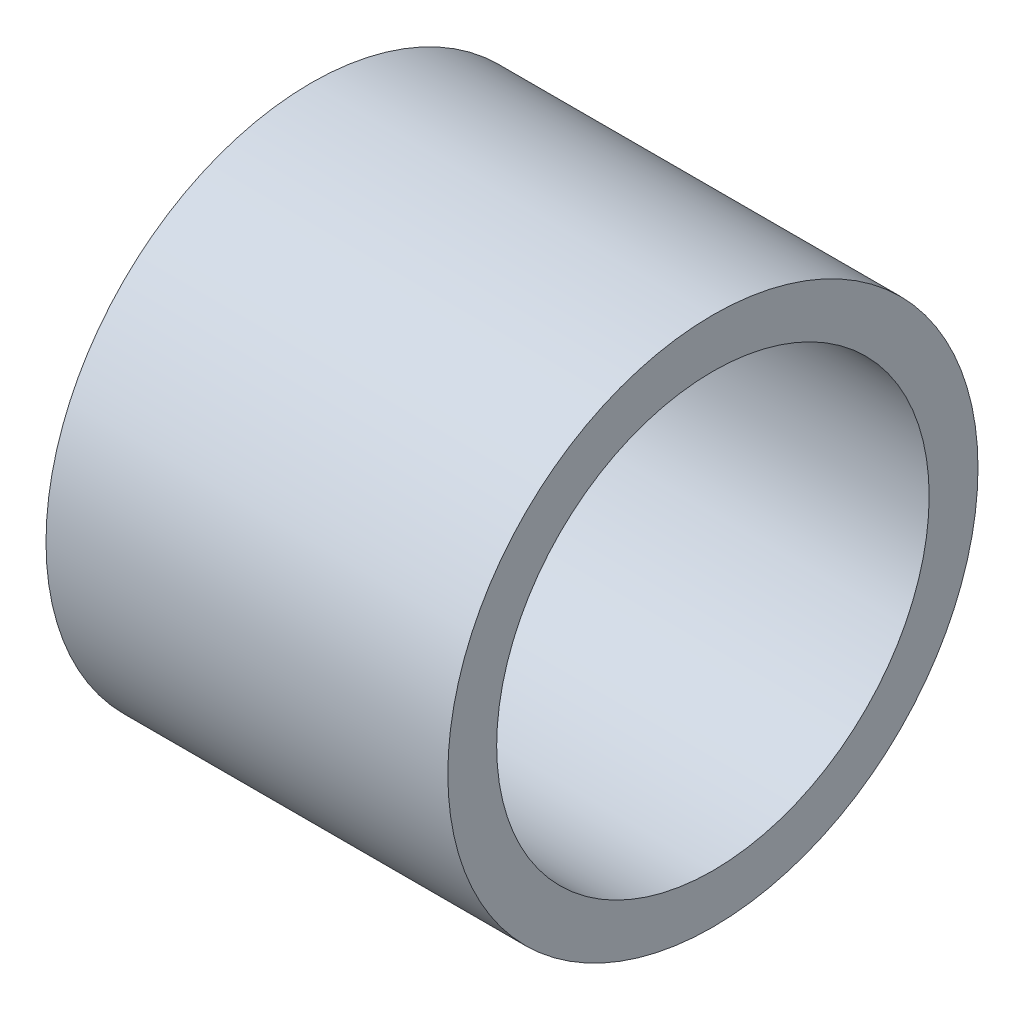
ISO-10303-21;
HEADER;
FILE_DESCRIPTION(('STEP AP214'),'2;1');
FILE_NAME('part.step','',(''),(''),'','','');
FILE_SCHEMA(('AUTOMOTIVE_DESIGN { 1 0 10303 214 1 1 1 1 }'));
ENDSEC;
DATA;
#1=APPLICATION_CONTEXT('core data for automotive mechanical design processes');
#2=APPLICATION_PROTOCOL_DEFINITION('international standard','automotive_design',2000,#1);
#3=PRODUCT_CONTEXT('',#1,'mechanical');
#4=PRODUCT('Part','Part','',(#3));
#5=PRODUCT_RELATED_PRODUCT_CATEGORY('part','',(#4));
#6=PRODUCT_DEFINITION_FORMATION('','',#4);
#7=PRODUCT_DEFINITION_CONTEXT('part definition',#1,'design');
#8=PRODUCT_DEFINITION('design','',#6,#7);
#9=PRODUCT_DEFINITION_SHAPE('','',#8);
#10=(LENGTH_UNIT() NAMED_UNIT(*) SI_UNIT(.MILLI.,.METRE.));
#11=(NAMED_UNIT(*) PLANE_ANGLE_UNIT() SI_UNIT($,.RADIAN.));
#12=(NAMED_UNIT(*) SI_UNIT($,.STERADIAN.) SOLID_ANGLE_UNIT());
#13=UNCERTAINTY_MEASURE_WITH_UNIT(LENGTH_MEASURE(1.E-05),#10,'distance_accuracy_value','');
#14=(GEOMETRIC_REPRESENTATION_CONTEXT(3) GLOBAL_UNCERTAINTY_ASSIGNED_CONTEXT((#13)) GLOBAL_UNIT_ASSIGNED_CONTEXT((#10,
#11,#12)) REPRESENTATION_CONTEXT('',''));
#15=CARTESIAN_POINT('',(0.,0.,0.));
#16=DIRECTION('',(0.,0.,1.));
#17=DIRECTION('',(1.,0.,0.));
#18=AXIS2_PLACEMENT_3D('',#15,#16,#17);
#19=CARTESIAN_POINT('',(7.2,0.,0.));
#20=DIRECTION('',(1.,0.,0.));
#21=DIRECTION('',(0.,0.,-1.));
#22=AXIS2_PLACEMENT_3D('',#19,#20,#21);
#23=PLANE('',#22);
#24=CARTESIAN_POINT('',(7.2,0.,0.));
#25=DIRECTION('',(1.,0.,0.));
#26=DIRECTION('',(0.,0.,-1.));
#27=AXIS2_PLACEMENT_3D('',#24,#25,#26);
#28=CIRCLE('',#27,9.5);
#29=CARTESIAN_POINT('',(7.2,0.,-9.5));
#30=VERTEX_POINT('',#29);
#31=EDGE_CURVE('E10',#30,#30,#28,.T.);
#32=ORIENTED_EDGE('',*,*,#31,.T.);
#33=EDGE_LOOP('',(#32));
#34=FACE_BOUND('',#33,.T.);
#35=CARTESIAN_POINT('',(7.2,0.,0.));
#36=DIRECTION('',(1.,0.,0.));
#37=DIRECTION('',(0.,0.,-1.));
#38=AXIS2_PLACEMENT_3D('',#35,#36,#37);
#39=CIRCLE('',#38,7.75);
#40=CARTESIAN_POINT('',(7.2,0.,-7.75));
#41=VERTEX_POINT('',#40);
#42=EDGE_CURVE('E48',#41,#41,#39,.T.);
#43=ORIENTED_EDGE('',*,*,#42,.F.);
#44=EDGE_LOOP('',(#43));
#45=FACE_BOUND('',#44,.T.);
#46=ADVANCED_FACE('F37',(#34,#45),#23,.T.);
#47=CARTESIAN_POINT('',(-7.2,0.,0.));
#48=DIRECTION('',(1.,0.,0.));
#49=DIRECTION('',(0.,0.,-1.));
#50=AXIS2_PLACEMENT_3D('',#47,#48,#49);
#51=PLANE('',#50);
#52=CARTESIAN_POINT('',(-7.2,0.,0.));
#53=DIRECTION('',(1.,0.,0.));
#54=DIRECTION('',(0.,0.,-1.));
#55=AXIS2_PLACEMENT_3D('',#52,#53,#54);
#56=CIRCLE('',#55,9.5);
#57=CARTESIAN_POINT('',(-7.2,0.,-9.5));
#58=VERTEX_POINT('',#57);
#59=EDGE_CURVE('E41',#58,#58,#56,.T.);
#60=ORIENTED_EDGE('',*,*,#59,.F.);
#61=EDGE_LOOP('',(#60));
#62=FACE_BOUND('',#61,.T.);
#63=CARTESIAN_POINT('',(-7.2,0.,0.));
#64=DIRECTION('',(1.,0.,0.));
#65=DIRECTION('',(0.,0.,-1.));
#66=AXIS2_PLACEMENT_3D('',#63,#64,#65);
#67=CIRCLE('',#66,7.75);
#68=CARTESIAN_POINT('',(-7.2,0.,-7.75));
#69=VERTEX_POINT('',#68);
#70=EDGE_CURVE('E50',#69,#69,#67,.T.);
#71=ORIENTED_EDGE('',*,*,#70,.T.);
#72=EDGE_LOOP('',(#71));
#73=FACE_BOUND('',#72,.T.);
#74=ADVANCED_FACE('F60',(#62,#73),#51,.F.);
#75=CARTESIAN_POINT('',(7.2,0.,0.));
#76=DIRECTION('',(-1.,0.,0.));
#77=DIRECTION('',(0.,0.,1.));
#78=AXIS2_PLACEMENT_3D('',#75,#76,#77);
#79=CYLINDRICAL_SURFACE('',#78,9.5);
#80=ORIENTED_EDGE('',*,*,#31,.F.);
#81=EDGE_LOOP('',(#80));
#82=FACE_BOUND('',#81,.T.);
#83=ORIENTED_EDGE('',*,*,#59,.T.);
#84=EDGE_LOOP('',(#83));
#85=FACE_BOUND('',#84,.T.);
#86=ADVANCED_FACE('F39',(#82,#85),#79,.T.);
#87=CARTESIAN_POINT('',(7.2,0.,0.));
#88=DIRECTION('',(-1.,0.,0.));
#89=DIRECTION('',(0.,0.,1.));
#90=AXIS2_PLACEMENT_3D('',#87,#88,#89);
#91=CYLINDRICAL_SURFACE('',#90,7.75);
#92=ORIENTED_EDGE('',*,*,#42,.T.);
#93=EDGE_LOOP('',(#92));
#94=FACE_BOUND('',#93,.T.);
#95=ORIENTED_EDGE('',*,*,#70,.F.);
#96=EDGE_LOOP('',(#95));
#97=FACE_BOUND('',#96,.T.);
#98=ADVANCED_FACE('F56',(#94,#97),#91,.F.);
#99=CLOSED_SHELL('',(#46,#74,#86,#98));
#100=MANIFOLD_SOLID_BREP('B2',#99);
#101=ADVANCED_BREP_SHAPE_REPRESENTATION('',(#18,#100),#14);
#102=SHAPE_DEFINITION_REPRESENTATION(#9,#101);
ENDSEC;
END-ISO-10303-21;
